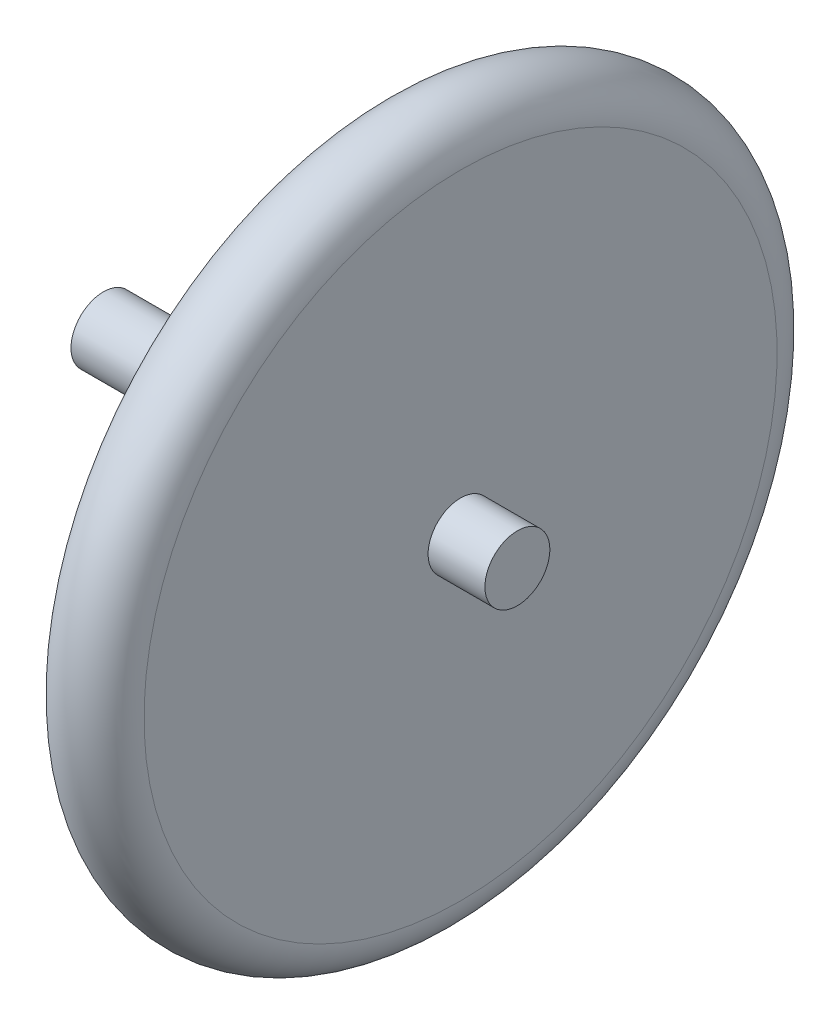
ISO-10303-21;
HEADER;
FILE_DESCRIPTION(('STEP AP214'),'2;1');
FILE_NAME('part.step','',(''),(''),'','','');
FILE_SCHEMA(('AUTOMOTIVE_DESIGN { 1 0 10303 214 1 1 1 1 }'));
ENDSEC;
DATA;
#1=APPLICATION_CONTEXT('core data for automotive mechanical design processes');
#2=APPLICATION_PROTOCOL_DEFINITION('international standard','automotive_design',2000,#1);
#3=PRODUCT_CONTEXT('',#1,'mechanical');
#4=PRODUCT('Part','Part','',(#3));
#5=PRODUCT_RELATED_PRODUCT_CATEGORY('part','',(#4));
#6=PRODUCT_DEFINITION_FORMATION('','',#4);
#7=PRODUCT_DEFINITION_CONTEXT('part definition',#1,'design');
#8=PRODUCT_DEFINITION('design','',#6,#7);
#9=PRODUCT_DEFINITION_SHAPE('','',#8);
#10=(LENGTH_UNIT() NAMED_UNIT(*) SI_UNIT(.MILLI.,.METRE.));
#11=(NAMED_UNIT(*) PLANE_ANGLE_UNIT() SI_UNIT($,.RADIAN.));
#12=(NAMED_UNIT(*) SI_UNIT($,.STERADIAN.) SOLID_ANGLE_UNIT());
#13=UNCERTAINTY_MEASURE_WITH_UNIT(LENGTH_MEASURE(1.E-05),#10,'distance_accuracy_value','');
#14=(GEOMETRIC_REPRESENTATION_CONTEXT(3) GLOBAL_UNCERTAINTY_ASSIGNED_CONTEXT((#13)) GLOBAL_UNIT_ASSIGNED_CONTEXT((#10,
#11,#12)) REPRESENTATION_CONTEXT('',''));
#15=CARTESIAN_POINT('',(0.,0.,0.));
#16=DIRECTION('',(0.,0.,1.));
#17=DIRECTION('',(1.,0.,0.));
#18=AXIS2_PLACEMENT_3D('',#15,#16,#17);
#19=CARTESIAN_POINT('',(6.,0.,0.));
#20=DIRECTION('',(1.,0.,0.));
#21=DIRECTION('',(0.,1.,0.));
#22=AXIS2_PLACEMENT_3D('',#19,#20,#21);
#23=PLANE('',#22);
#24=CARTESIAN_POINT('',(6.,0.,0.));
#25=DIRECTION('',(1.,0.,0.));
#26=DIRECTION('',(0.,1.,0.));
#27=AXIS2_PLACEMENT_3D('',#24,#25,#26);
#28=CIRCLE('',#27,2.);
#29=CARTESIAN_POINT('',(6.,2.,0.));
#30=VERTEX_POINT('',#29);
#31=EDGE_CURVE('E64',#30,#30,#28,.T.);
#32=ORIENTED_EDGE('',*,*,#31,.T.);
#33=EDGE_LOOP('',(#32));
#34=FACE_BOUND('',#33,.T.);
#35=ADVANCED_FACE('F37',(#34),#23,.T.);
#36=CARTESIAN_POINT('',(-19.5,0.,0.));
#37=DIRECTION('',(-1.,0.,0.));
#38=DIRECTION('',(0.,-1.,0.));
#39=AXIS2_PLACEMENT_3D('',#36,#37,#38);
#40=PLANE('',#39);
#41=CARTESIAN_POINT('',(-19.5,0.,0.));
#42=DIRECTION('',(1.,0.,0.));
#43=DIRECTION('',(0.,1.,0.));
#44=AXIS2_PLACEMENT_3D('',#41,#42,#43);
#45=CIRCLE('',#44,2.);
#46=CARTESIAN_POINT('',(-19.5,2.,0.));
#47=VERTEX_POINT('',#46);
#48=EDGE_CURVE('E10',#47,#47,#45,.T.);
#49=ORIENTED_EDGE('',*,*,#48,.F.);
#50=EDGE_LOOP('',(#49));
#51=FACE_BOUND('',#50,.T.);
#52=ADVANCED_FACE('F82',(#51),#40,.T.);
#53=CARTESIAN_POINT('',(0.,0.,0.));
#54=DIRECTION('',(1.,0.,0.));
#55=DIRECTION('',(0.,1.,0.));
#56=AXIS2_PLACEMENT_3D('',#53,#54,#55);
#57=CYLINDRICAL_SURFACE('',#56,2.);
#58=ORIENTED_EDGE('',*,*,#48,.T.);
#59=EDGE_LOOP('',(#58));
#60=FACE_BOUND('',#59,.T.);
#61=CARTESIAN_POINT('',(-2.5,0.,0.));
#62=DIRECTION('',(1.,0.,0.));
#63=DIRECTION('',(0.,1.,0.));
#64=AXIS2_PLACEMENT_3D('',#61,#62,#63);
#65=CIRCLE('',#64,2.);
#66=CARTESIAN_POINT('',(-2.5,2.,0.));
#67=VERTEX_POINT('',#66);
#68=EDGE_CURVE('E44',#67,#67,#65,.T.);
#69=ORIENTED_EDGE('',*,*,#68,.F.);
#70=EDGE_LOOP('',(#69));
#71=FACE_BOUND('',#70,.T.);
#72=ADVANCED_FACE('F86',(#60,#71),#57,.T.);
#73=CARTESIAN_POINT('',(-2.5,19.5,0.));
#74=DIRECTION('',(-1.,0.,0.));
#75=DIRECTION('',(0.,-1.,0.));
#76=AXIS2_PLACEMENT_3D('',#73,#74,#75);
#77=PLANE('',#76);
#78=ORIENTED_EDGE('',*,*,#68,.T.);
#79=EDGE_LOOP('',(#78));
#80=FACE_BOUND('',#79,.T.);
#81=CARTESIAN_POINT('',(-2.5,0.,0.));
#82=DIRECTION('',(1.,0.,0.));
#83=DIRECTION('',(0.,1.,0.));
#84=AXIS2_PLACEMENT_3D('',#81,#82,#83);
#85=CIRCLE('',#84,19.5);
#86=CARTESIAN_POINT('',(-2.5,19.5,0.));
#87=VERTEX_POINT('',#86);
#88=EDGE_CURVE('E49',#87,#87,#85,.T.);
#89=ORIENTED_EDGE('',*,*,#88,.F.);
#90=EDGE_LOOP('',(#89));
#91=FACE_BOUND('',#90,.T.);
#92=ADVANCED_FACE('F91',(#80,#91),#77,.T.);
#93=CARTESIAN_POINT('',(0.,0.,0.));
#94=DIRECTION('',(1.,0.,0.));
#95=DIRECTION('',(0.,1.,0.));
#96=AXIS2_PLACEMENT_3D('',#93,#94,#95);
#97=TOROIDAL_SURFACE('',#96,19.5,2.5);
#98=ORIENTED_EDGE('',*,*,#88,.T.);
#99=EDGE_LOOP('',(#98));
#100=FACE_BOUND('',#99,.T.);
#101=CARTESIAN_POINT('',(2.5,0.,0.));
#102=DIRECTION('',(1.,0.,0.));
#103=DIRECTION('',(0.,1.,0.));
#104=AXIS2_PLACEMENT_3D('',#101,#102,#103);
#105=CIRCLE('',#104,19.5);
#106=CARTESIAN_POINT('',(2.5,19.5,0.));
#107=VERTEX_POINT('',#106);
#108=EDGE_CURVE('E54',#107,#107,#105,.T.);
#109=ORIENTED_EDGE('',*,*,#108,.F.);
#110=EDGE_LOOP('',(#109));
#111=FACE_BOUND('',#110,.T.);
#112=ADVANCED_FACE('F78',(#100,#111),#97,.T.);
#113=CARTESIAN_POINT('',(2.5,19.5,0.));
#114=DIRECTION('',(1.,0.,0.));
#115=DIRECTION('',(0.,1.,0.));
#116=AXIS2_PLACEMENT_3D('',#113,#114,#115);
#117=PLANE('',#116);
#118=ORIENTED_EDGE('',*,*,#108,.T.);
#119=EDGE_LOOP('',(#118));
#120=FACE_BOUND('',#119,.T.);
#121=CARTESIAN_POINT('',(2.5,0.,0.));
#122=DIRECTION('',(1.,0.,0.));
#123=DIRECTION('',(0.,1.,0.));
#124=AXIS2_PLACEMENT_3D('',#121,#122,#123);
#125=CIRCLE('',#124,2.);
#126=CARTESIAN_POINT('',(2.5,2.,0.));
#127=VERTEX_POINT('',#126);
#128=EDGE_CURVE('E60',#127,#127,#125,.T.);
#129=ORIENTED_EDGE('',*,*,#128,.F.);
#130=EDGE_LOOP('',(#129));
#131=FACE_BOUND('',#130,.T.);
#132=ADVANCED_FACE('F72',(#120,#131),#117,.T.);
#133=CARTESIAN_POINT('',(0.,0.,0.));
#134=DIRECTION('',(1.,0.,0.));
#135=DIRECTION('',(0.,1.,0.));
#136=AXIS2_PLACEMENT_3D('',#133,#134,#135);
#137=CYLINDRICAL_SURFACE('',#136,2.);
#138=ORIENTED_EDGE('',*,*,#128,.T.);
#139=EDGE_LOOP('',(#138));
#140=FACE_BOUND('',#139,.T.);
#141=ORIENTED_EDGE('',*,*,#31,.F.);
#142=EDGE_LOOP('',(#141));
#143=FACE_BOUND('',#142,.T.);
#144=ADVANCED_FACE('F70',(#140,#143),#137,.T.);
#145=CLOSED_SHELL('',(#35,#52,#72,#92,#112,#132,#144));
#146=MANIFOLD_SOLID_BREP('B2',#145);
#147=ADVANCED_BREP_SHAPE_REPRESENTATION('',(#18,#146),#14);
#148=SHAPE_DEFINITION_REPRESENTATION(#9,#147);
ENDSEC;
END-ISO-10303-21;
